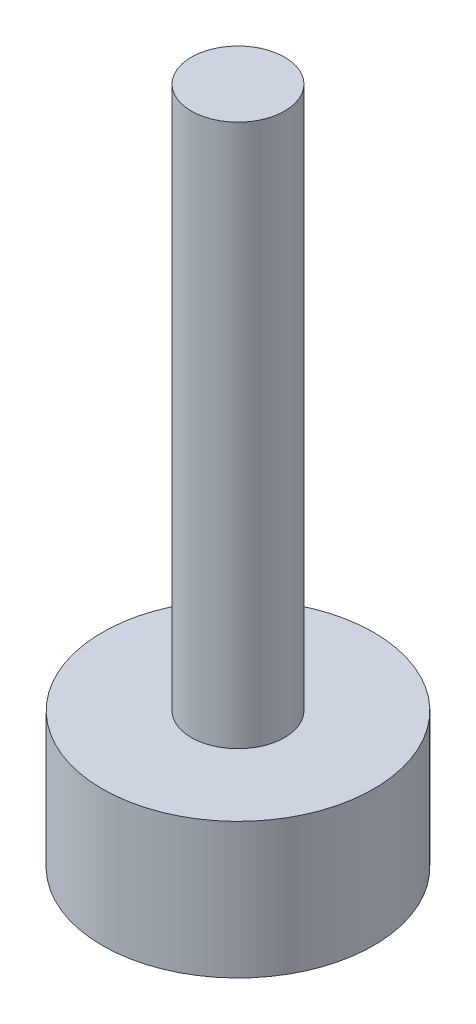
ISO-10303-21;
HEADER;
FILE_DESCRIPTION(('STEP AP214'),'2;1');
FILE_NAME('part.step','',(''),(''),'','','');
FILE_SCHEMA(('AUTOMOTIVE_DESIGN { 1 0 10303 214 1 1 1 1 }'));
ENDSEC;
DATA;
#1=APPLICATION_CONTEXT('core data for automotive mechanical design processes');
#2=APPLICATION_PROTOCOL_DEFINITION('international standard','automotive_design',2000,#1);
#3=PRODUCT_CONTEXT('',#1,'mechanical');
#4=PRODUCT('Part','Part','',(#3));
#5=PRODUCT_RELATED_PRODUCT_CATEGORY('part','',(#4));
#6=PRODUCT_DEFINITION_FORMATION('','',#4);
#7=PRODUCT_DEFINITION_CONTEXT('part definition',#1,'design');
#8=PRODUCT_DEFINITION('design','',#6,#7);
#9=PRODUCT_DEFINITION_SHAPE('','',#8);
#10=(LENGTH_UNIT() NAMED_UNIT(*) SI_UNIT(.MILLI.,.METRE.));
#11=(NAMED_UNIT(*) PLANE_ANGLE_UNIT() SI_UNIT($,.RADIAN.));
#12=(NAMED_UNIT(*) SI_UNIT($,.STERADIAN.) SOLID_ANGLE_UNIT());
#13=UNCERTAINTY_MEASURE_WITH_UNIT(LENGTH_MEASURE(1.E-05),#10,'distance_accuracy_value','');
#14=(GEOMETRIC_REPRESENTATION_CONTEXT(3) GLOBAL_UNCERTAINTY_ASSIGNED_CONTEXT((#13)) GLOBAL_UNIT_ASSIGNED_CONTEXT((#10,
#11,#12)) REPRESENTATION_CONTEXT('',''));
#15=CARTESIAN_POINT('',(0.,0.,0.));
#16=DIRECTION('',(0.,0.,1.));
#17=DIRECTION('',(1.,0.,0.));
#18=AXIS2_PLACEMENT_3D('',#15,#16,#17);
#19=CARTESIAN_POINT('',(0.,0.,0.));
#20=DIRECTION('',(0.,1.,0.));
#21=DIRECTION('',(0.,0.,1.));
#22=AXIS2_PLACEMENT_3D('',#19,#20,#21);
#23=PLANE('',#22);
#24=CARTESIAN_POINT('',(0.,0.,0.));
#25=DIRECTION('',(0.,1.,0.));
#26=DIRECTION('',(0.,0.,1.));
#27=AXIS2_PLACEMENT_3D('',#24,#25,#26);
#28=CIRCLE('',#27,3.175);
#29=CARTESIAN_POINT('',(0.,0.,3.175));
#30=VERTEX_POINT('',#29);
#31=EDGE_CURVE('E35',#30,#30,#28,.T.);
#32=ORIENTED_EDGE('',*,*,#31,.T.);
#33=EDGE_LOOP('',(#32));
#34=FACE_BOUND('',#33,.T.);
#35=CARTESIAN_POINT('',(0.,0.,0.));
#36=DIRECTION('',(0.,1.,0.));
#37=DIRECTION('',(0.,0.,1.));
#38=AXIS2_PLACEMENT_3D('',#35,#36,#37);
#39=CIRCLE('',#38,1.0922);
#40=CARTESIAN_POINT('',(0.,0.,1.0922));
#41=VERTEX_POINT('',#40);
#42=EDGE_CURVE('E44',#41,#41,#39,.T.);
#43=ORIENTED_EDGE('',*,*,#42,.F.);
#44=EDGE_LOOP('',(#43));
#45=FACE_BOUND('',#44,.T.);
#46=ADVANCED_FACE('F31',(#34,#45),#23,.T.);
#47=CARTESIAN_POINT('',(0.,-3.175,0.));
#48=DIRECTION('',(0.,1.,0.));
#49=DIRECTION('',(0.,0.,1.));
#50=AXIS2_PLACEMENT_3D('',#47,#48,#49);
#51=CYLINDRICAL_SURFACE('',#50,3.175);
#52=CARTESIAN_POINT('',(0.,-3.175,0.));
#53=DIRECTION('',(0.,1.,0.));
#54=DIRECTION('',(0.,0.,1.));
#55=AXIS2_PLACEMENT_3D('',#52,#53,#54);
#56=CIRCLE('',#55,3.175);
#57=CARTESIAN_POINT('',(0.,-3.175,3.175));
#58=VERTEX_POINT('',#57);
#59=EDGE_CURVE('E10',#58,#58,#56,.T.);
#60=ORIENTED_EDGE('',*,*,#59,.T.);
#61=EDGE_LOOP('',(#60));
#62=FACE_BOUND('',#61,.T.);
#63=ORIENTED_EDGE('',*,*,#31,.F.);
#64=EDGE_LOOP('',(#63));
#65=FACE_BOUND('',#64,.T.);
#66=ADVANCED_FACE('F33',(#62,#65),#51,.T.);
#67=CARTESIAN_POINT('',(0.,-3.175,0.));
#68=DIRECTION('',(0.,1.,0.));
#69=DIRECTION('',(0.,0.,1.));
#70=AXIS2_PLACEMENT_3D('',#67,#68,#69);
#71=PLANE('',#70);
#72=ORIENTED_EDGE('',*,*,#59,.F.);
#73=EDGE_LOOP('',(#72));
#74=FACE_BOUND('',#73,.T.);
#75=ADVANCED_FACE('F55',(#74),#71,.F.);
#76=CARTESIAN_POINT('',(0.,12.7,0.));
#77=DIRECTION('',(0.,-1.,0.));
#78=DIRECTION('',(0.,0.,-1.));
#79=AXIS2_PLACEMENT_3D('',#76,#77,#78);
#80=CYLINDRICAL_SURFACE('',#79,1.0922);
#81=CARTESIAN_POINT('',(0.,12.7,0.));
#82=DIRECTION('',(0.,1.,0.));
#83=DIRECTION('',(0.,0.,1.));
#84=AXIS2_PLACEMENT_3D('',#81,#82,#83);
#85=CIRCLE('',#84,1.0922);
#86=CARTESIAN_POINT('',(0.,12.7,1.0922));
#87=VERTEX_POINT('',#86);
#88=EDGE_CURVE('E42',#87,#87,#85,.T.);
#89=ORIENTED_EDGE('',*,*,#88,.F.);
#90=EDGE_LOOP('',(#89));
#91=FACE_BOUND('',#90,.T.);
#92=ORIENTED_EDGE('',*,*,#42,.T.);
#93=EDGE_LOOP('',(#92));
#94=FACE_BOUND('',#93,.T.);
#95=ADVANCED_FACE('F52',(#91,#94),#80,.T.);
#96=CARTESIAN_POINT('',(0.,12.7,0.));
#97=DIRECTION('',(0.,1.,0.));
#98=DIRECTION('',(0.,0.,1.));
#99=AXIS2_PLACEMENT_3D('',#96,#97,#98);
#100=PLANE('',#99);
#101=ORIENTED_EDGE('',*,*,#88,.T.);
#102=EDGE_LOOP('',(#101));
#103=FACE_BOUND('',#102,.T.);
#104=ADVANCED_FACE('F50',(#103),#100,.T.);
#105=CLOSED_SHELL('',(#46,#66,#75,#95,#104));
#106=MANIFOLD_SOLID_BREP('B2',#105);
#107=ADVANCED_BREP_SHAPE_REPRESENTATION('',(#18,#106),#14);
#108=SHAPE_DEFINITION_REPRESENTATION(#9,#107);
ENDSEC;
END-ISO-10303-21;
